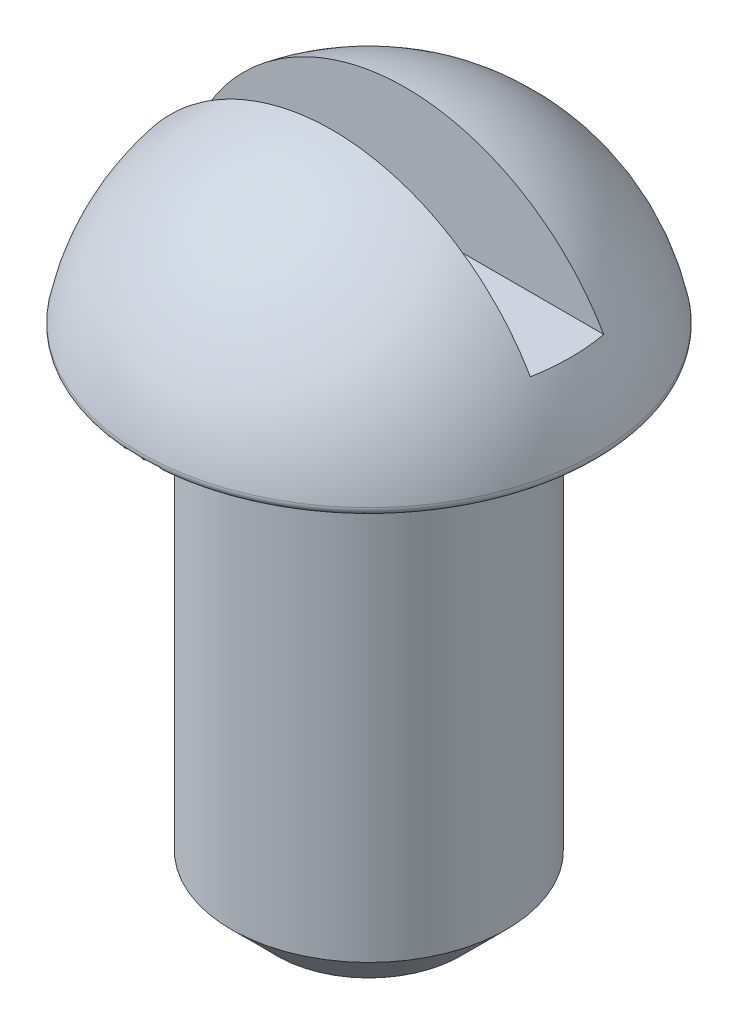
ISO-10303-21;
HEADER;
FILE_DESCRIPTION(('STEP AP214'),'2;1');
FILE_NAME('part.step','',(''),(''),'','','');
FILE_SCHEMA(('AUTOMOTIVE_DESIGN { 1 0 10303 214 1 1 1 1 }'));
ENDSEC;
DATA;
#1=APPLICATION_CONTEXT('core data for automotive mechanical design processes');
#2=APPLICATION_PROTOCOL_DEFINITION('international standard','automotive_design',2000,#1);
#3=PRODUCT_CONTEXT('',#1,'mechanical');
#4=PRODUCT('Part','Part','',(#3));
#5=PRODUCT_RELATED_PRODUCT_CATEGORY('part','',(#4));
#6=PRODUCT_DEFINITION_FORMATION('','',#4);
#7=PRODUCT_DEFINITION_CONTEXT('part definition',#1,'design');
#8=PRODUCT_DEFINITION('design','',#6,#7);
#9=PRODUCT_DEFINITION_SHAPE('','',#8);
#10=(LENGTH_UNIT() NAMED_UNIT(*) SI_UNIT(.MILLI.,.METRE.));
#11=(NAMED_UNIT(*) PLANE_ANGLE_UNIT() SI_UNIT($,.RADIAN.));
#12=(NAMED_UNIT(*) SI_UNIT($,.STERADIAN.) SOLID_ANGLE_UNIT());
#13=UNCERTAINTY_MEASURE_WITH_UNIT(LENGTH_MEASURE(1.E-05),#10,'distance_accuracy_value','');
#14=(GEOMETRIC_REPRESENTATION_CONTEXT(3) GLOBAL_UNCERTAINTY_ASSIGNED_CONTEXT((#13)) GLOBAL_UNIT_ASSIGNED_CONTEXT((#10,
#11,#12)) REPRESENTATION_CONTEXT('',''));
#15=CARTESIAN_POINT('',(0.,0.,0.));
#16=DIRECTION('',(0.,0.,1.));
#17=DIRECTION('',(1.,0.,0.));
#18=AXIS2_PLACEMENT_3D('',#15,#16,#17);
#19=CARTESIAN_POINT('',(0.,89.2175900971477,0.));
#20=DIRECTION('',(0.,1.,0.));
#21=DIRECTION('',(-1.,0.,0.));
#22=AXIS2_PLACEMENT_3D('',#19,#20,#21);
#23=DEGENERATE_TOROIDAL_SURFACE('',#22,0.0317230428537969,5.1,.F.);
#24=CARTESIAN_POINT('',(0.,90.2290623231183,0.));
#25=DIRECTION('',(0.,-1.,0.));
#26=DIRECTION('',(1.,0.,0.));
#27=AXIS2_PLACEMENT_3D('',#24,#25,#26);
#28=CIRCLE('',#27,4.96696917972703);
#29=CARTESIAN_POINT('',(4.96696917972703,90.2290623231183,0.));
#30=VERTEX_POINT('',#29);
#31=EDGE_CURVE('E109',#30,#30,#28,.F.);
#32=ORIENTED_EDGE('',*,*,#31,.T.);
#33=EDGE_LOOP('',(#32));
#34=FACE_BOUND('',#33,.T.);
#35=CARTESIAN_POINT('',(0.,91.7493131400015,0.));
#36=DIRECTION('',(0.,1.,0.));
#37=DIRECTION('',(0.,0.,1.));
#38=AXIS2_PLACEMENT_3D('',#35,#36,#37);
#39=CIRCLE('',#38,4.39550842097132);
#40=CARTESIAN_POINT('',(4.32209373785781,91.7493131400015,0.8));
#41=VERTEX_POINT('',#40);
#42=CARTESIAN_POINT('',(4.32209373785781,91.7493131400015,-0.8));
#43=VERTEX_POINT('',#42);
#44=EDGE_CURVE('E59',#41,#43,#39,.T.);
#45=ORIENTED_EDGE('',*,*,#44,.F.);
#46=CARTESIAN_POINT('',(0.,94.2493131400015,0.8));
#47=CARTESIAN_POINT('',(-0.134740307442988,94.2493085427857,0.8));
#48=CARTESIAN_POINT('',(-0.269527835350804,94.243664796133,0.8));
#49=CARTESIAN_POINT('',(-0.538288632330176,94.2212696538608,0.8));
#50=CARTESIAN_POINT('',(-0.672260633696777,94.2045040055317,0.8));
#51=CARTESIAN_POINT('',(-1.07466472708265,94.1373807183404,0.8));
#52=CARTESIAN_POINT('',(-1.34049574401895,94.0702039488135,0.8));
#53=CARTESIAN_POINT('',(-1.85788182126191,93.8934890746751,0.8));
#54=CARTESIAN_POINT('',(-2.10941818866405,93.7838969023489,0.8));
#55=CARTESIAN_POINT('',(-2.5987224591261,93.5213717601867,0.8));
#56=CARTESIAN_POINT('',(-2.83584195785824,93.3672258168607,0.8));
#57=CARTESIAN_POINT('',(-3.28090852228794,93.021510567915,0.8));
#58=CARTESIAN_POINT('',(-3.48886181324254,92.8299492692049,0.800000000000001));
#59=CARTESIAN_POINT('',(-3.8706865741645,92.4138533833618,0.800000000000001));
#60=CARTESIAN_POINT('',(-4.04440346673736,92.1891769072349,0.800000000000001));
#61=CARTESIAN_POINT('',(-4.35167938801028,91.7138362807661,0.800000000000001));
#62=CARTESIAN_POINT('',(-4.48523600357525,91.4631705700098,0.800000000000001));
#63=CARTESIAN_POINT('',(-4.70844617354246,90.9429089519378,0.800000000000001));
#64=CARTESIAN_POINT('',(-4.79808041716767,90.6733047776465,0.800000000000001));
#65=CARTESIAN_POINT('',(-4.93080788087344,90.122723546352,0.800000000000001));
#66=CARTESIAN_POINT('',(-4.97390155242599,89.841746599699,0.800000000000001));
#67=CARTESIAN_POINT('',(-5.00274861637339,89.4181129554516,0.800000000000001));
#68=CARTESIAN_POINT('',(-5.00639030410464,89.2764562420645,0.800000000000001));
#69=CARTESIAN_POINT('',(-5.00173379189394,88.9933532159882,0.800000000000001));
#70=CARTESIAN_POINT('',(-4.99343999670825,88.8519068449544,0.800000000000001));
#71=CARTESIAN_POINT('',(-4.96496113933905,88.570173081277,0.800000000000001));
#72=CARTESIAN_POINT('',(-4.94477164891222,88.4298861399686,0.800000000000001));
#73=CARTESIAN_POINT('',(-4.89265447612704,88.151560895802,0.800000000000001));
#74=CARTESIAN_POINT('',(-4.86073112906789,88.0135217820865,0.800000000000001));
#75=CARTESIAN_POINT('',(-4.7853566396299,87.7405712325978,0.800000000000001));
#76=CARTESIAN_POINT('',(-4.74190108429813,87.6056610156739,0.800000000000001));
#77=CARTESIAN_POINT('',(-4.64379511126672,87.340030847084,0.800000000000001));
#78=CARTESIAN_POINT('',(-4.58914883169654,87.2093093671029,0.800000000000001));
#79=CARTESIAN_POINT('',(-4.46901756133623,86.952886797671,0.800000000000001));
#80=CARTESIAN_POINT('',(-4.40352860026028,86.827187568234,0.800000000000001));
#81=CARTESIAN_POINT('',(-4.26221776818858,86.5817999134213,0.800000000000001));
#82=CARTESIAN_POINT('',(-4.1863997212632,86.4621092858577,0.800000000000001));
#83=CARTESIAN_POINT('',(-4.02492426614422,86.2295019598518,0.800000000000001));
#84=CARTESIAN_POINT('',(-3.93926364510018,86.1165874917231,0.800000000000001));
#85=CARTESIAN_POINT('',(-3.75876528803492,85.8984190720078,0.800000000000001));
#86=CARTESIAN_POINT('',(-3.66393095336552,85.7931623063323,0.8));
#87=CARTESIAN_POINT('',(-3.46569646326092,85.5909759683807,0.8));
#88=CARTESIAN_POINT('',(-3.36229325062922,85.4940493934858,0.8));
#89=CARTESIAN_POINT('',(-3.14772497637245,85.3092907085601,0.8));
#90=CARTESIAN_POINT('',(-3.03656279903408,85.2214552488649,0.8));
#91=CARTESIAN_POINT('',(-2.80721945837872,85.0554554259879,0.8));
#92=CARTESIAN_POINT('',(-2.68903753973223,84.9772921063359,0.8));
#93=CARTESIAN_POINT('',(-2.44654973940192,84.831234180271,0.8));
#94=CARTESIAN_POINT('',(-2.32224614451551,84.7633357773233,0.8));
#95=CARTESIAN_POINT('',(-2.06831629181173,84.6382422846071,0.8));
#96=CARTESIAN_POINT('',(-1.93868837414178,84.5810505639968,0.8));
#97=CARTESIAN_POINT('',(-1.67506389601165,84.4778149603087,0.8));
#98=CARTESIAN_POINT('',(-1.5410672602134,84.4317712695929,0.8));
#99=CARTESIAN_POINT('',(-1.26977080002715,84.3512198249581,0.8));
#100=CARTESIAN_POINT('',(-1.13247381938942,84.3167024961024,0.8));
#101=CARTESIAN_POINT('',(-0.855443575238245,84.2594537965441,0.8));
#102=CARTESIAN_POINT('',(-0.715710337675658,84.2367223003787,0.8));
#103=CARTESIAN_POINT('',(-0.434849415376107,84.2033532765143,0.8));
#104=CARTESIAN_POINT('',(-0.293722231274832,84.1927115554526,0.8));
#105=CARTESIAN_POINT('',(-0.0110836469692735,84.1838211535471,0.8));
#106=CARTESIAN_POINT('',(0.130427732141535,84.1855718055492,0.8));
#107=CARTESIAN_POINT('',(0.409772158897323,84.2012314410897,0.8));
#108=CARTESIAN_POINT('',(0.547619662692202,84.2148822845066,0.8));
#109=CARTESIAN_POINT('',(0.821656949929552,84.2536620275972,0.8));
#110=CARTESIAN_POINT('',(0.957846652986969,84.2787914815989,0.8));
#111=CARTESIAN_POINT('',(1.36262509817613,84.3710492832896,0.8));
#112=CARTESIAN_POINT('',(1.62757168531692,84.4550558146594,0.8));
#113=CARTESIAN_POINT('',(2.142547111017,84.666559476271,0.8));
#114=CARTESIAN_POINT('',(2.39239336921354,84.7944973257188,0.8));
#115=CARTESIAN_POINT('',(2.86737610264902,85.0900583763382,0.8));
#116=CARTESIAN_POINT('',(3.09251640739483,85.2576754143477,0.8));
#117=CARTESIAN_POINT('',(3.51422714639577,85.6300319402105,0.8));
#118=CARTESIAN_POINT('',(3.71044715076847,85.8351683615819,0.8));
#119=CARTESIAN_POINT('',(4.06571578247768,86.2754675977019,0.8));
#120=CARTESIAN_POINT('',(4.22476075862274,86.5106333583149,0.8));
#121=CARTESIAN_POINT('',(4.50126117243079,87.0045069594602,0.8));
#122=CARTESIAN_POINT('',(4.61868360820359,87.2632332774375,0.799999999999999));
#123=CARTESIAN_POINT('',(4.80843008334655,87.7967183022827,0.799999999999999));
#124=CARTESIAN_POINT('',(4.88075523191155,88.0714766146523,0.799999999999999));
#125=CARTESIAN_POINT('',(4.97826895865465,88.6292825699496,0.799999999999999));
#126=CARTESIAN_POINT('',(5.00344952754638,88.9123316130767,0.799999999999999));
#127=CARTESIAN_POINT('',(5.00593522337818,89.4786408333967,0.799999999999999));
#128=CARTESIAN_POINT('',(4.98324016958901,89.7619010113826,0.799999999999999));
#129=CARTESIAN_POINT('',(4.89061731486903,90.3205965919497,0.799999999999999));
#130=CARTESIAN_POINT('',(4.82068859257744,90.5960318417852,0.799999999999999));
#131=CARTESIAN_POINT('',(4.63557894391363,91.1312597779937,0.799999999999999));
#132=CARTESIAN_POINT('',(4.52039683038463,91.3910520537899,0.8));
#133=CARTESIAN_POINT('',(4.24804392609076,91.8876189280836,0.8));
#134=CARTESIAN_POINT('',(4.0908715856573,92.1243926766319,0.8));
#135=CARTESIAN_POINT('',(3.73902502945746,92.5681519258149,0.8));
#136=CARTESIAN_POINT('',(3.54435656995658,92.7751419902206,0.8));
#137=CARTESIAN_POINT('',(3.1231160659952,93.1534161988023,0.8));
#138=CARTESIAN_POINT('',(2.89655705835061,93.3247148629576,0.8));
#139=CARTESIAN_POINT('',(2.4177017274986,93.6269428774709,0.8));
#140=CARTESIAN_POINT('',(2.16538737162668,93.7578436815839,0.8));
#141=CARTESIAN_POINT('',(1.6422786709378,93.9753775693474,0.8));
#142=CARTESIAN_POINT('',(1.37147618584527,94.0619910090337,0.8));
#143=CARTESIAN_POINT('',(0.819588743853391,94.1880219485546,0.8));
#144=CARTESIAN_POINT('',(0.538533295387108,94.2275653368913,0.8));
#145=CARTESIAN_POINT('',(0.171114889922167,94.2470447676542,0.8));
#146=CARTESIAN_POINT('',(0.0855669667262859,94.2493160594681,0.8));
#147=CARTESIAN_POINT('',(0.,94.2493131400015,0.8));
#148=B_SPLINE_CURVE_WITH_KNOTS('',3,(#46,#47,#48,#49,#50,#51,#52,#53,#54,#55,#56,#57,#58,#59,
#60,#61,#62,#63,#64,#65,#66,#67,#68,#69,#70,#71,#72,#73,#74,#75,#76,#77,#78,#79,#80,#81,#82,#83,
#84,#85,#86,#87,#88,#89,#90,#91,#92,#93,#94,#95,#96,#97,#98,#99,#100,#101,#102,#103,#104,#105,
#106,#107,#108,#109,#110,#111,#112,#113,#114,#115,#116,#117,#118,#119,#120,#121,#122,#123,#124,
#125,#126,#127,#128,#129,#130,#131,#132,#133,#134,#135,#136,#137,#138,#139,#140,#141,#142,#143,
#144,#145,#146,#147),.UNSPECIFIED.,.T.,.F.,(4,2,2,2,2,2,2,2,2,2,2,2,2,2,2,2,2,2,2,2,2,2,2,2,2,2,
2,2,2,2,2,2,2,2,2,2,2,2,2,2,2,2,2,2,2,2,2,2,2,2,4),(0.,0.404172939796291,0.808864830104376,
1.62740624911861,2.44699453328071,3.29142444495087,4.13567384569077,4.98365184582015,
5.83168078874412,6.6800822397263,7.5284754606218,7.95317297049329,8.37771378713626,
8.80241274156028,9.226954940249,9.65165983050094,10.0762079551572,10.5009118826478,
10.9254589999038,11.3501450952619,11.7746743282772,12.1993556819883,12.623879998594,
13.0484500773804,13.4728627404297,13.8974087331678,14.3219620510308,14.7461618104412,
15.1703570540606,15.5944051197412,16.0184303565972,16.4334802390476,16.8485501673091,
17.6782492093378,18.5165274988801,19.3546756683486,20.202266073621,21.0499396910876,
21.8982839207727,22.7466072840996,23.5950747540977,24.4435454270442,25.292032651112,
26.1405421354919,26.9890829388305,27.8374935809967,28.6855583958258,29.5342211117814,
30.3832599320714,31.2300228654701,31.4866932942937),.UNSPECIFIED.);
#149=CARTESIAN_POINT('',(-4.32209373785782,91.7493131400015,0.800000000000001));
#150=VERTEX_POINT('',#149);
#151=EDGE_CURVE('E57',#41,#150,#148,.T.);
#152=ORIENTED_EDGE('',*,*,#151,.T.);
#153=CARTESIAN_POINT('',(-4.32209373785782,91.7493131400015,-0.799999999999999));
#154=VERTEX_POINT('',#153);
#155=EDGE_CURVE('E58',#154,#150,#39,.T.);
#156=ORIENTED_EDGE('',*,*,#155,.F.);
#157=CARTESIAN_POINT('',(0.,94.2493131400015,-0.8));
#158=CARTESIAN_POINT('',(0.134740307442975,94.2493085427857,-0.8));
#159=CARTESIAN_POINT('',(0.269527835350791,94.243664796133,-0.8));
#160=CARTESIAN_POINT('',(0.538288632330163,94.2212696538608,-0.8));
#161=CARTESIAN_POINT('',(0.672260633696764,94.2045040055317,-0.8));
#162=CARTESIAN_POINT('',(1.07466472708264,94.1373807183404,-0.8));
#163=CARTESIAN_POINT('',(1.34049574401893,94.0702039488135,-0.8));
#164=CARTESIAN_POINT('',(1.8578818212619,93.8934890746751,-0.8));
#165=CARTESIAN_POINT('',(2.10941818866404,93.7838969023489,-0.8));
#166=CARTESIAN_POINT('',(2.59872245912609,93.5213717601867,-0.8));
#167=CARTESIAN_POINT('',(2.83584195785822,93.3672258168607,-0.8));
#168=CARTESIAN_POINT('',(3.28090852228793,93.021510567915,-0.8));
#169=CARTESIAN_POINT('',(3.48886181324253,92.8299492692049,-0.8));
#170=CARTESIAN_POINT('',(3.87068657416448,92.4138533833618,-0.8));
#171=CARTESIAN_POINT('',(4.04440346673735,92.1891769072349,-0.8));
#172=CARTESIAN_POINT('',(4.35167938801026,91.7138362807661,-0.8));
#173=CARTESIAN_POINT('',(4.48523600357524,91.4631705700098,-0.800000000000001));
#174=CARTESIAN_POINT('',(4.70844617354244,90.9429089519378,-0.800000000000001));
#175=CARTESIAN_POINT('',(4.79808041716765,90.6733047776465,-0.800000000000001));
#176=CARTESIAN_POINT('',(4.93080788087342,90.122723546352,-0.800000000000001));
#177=CARTESIAN_POINT('',(4.97390155242597,89.841746599699,-0.800000000000001));
#178=CARTESIAN_POINT('',(5.00274861637338,89.4181129554516,-0.800000000000001));
#179=CARTESIAN_POINT('',(5.00639030410462,89.2764562420645,-0.800000000000001));
#180=CARTESIAN_POINT('',(5.00173379189393,88.9933532159882,-0.800000000000001));
#181=CARTESIAN_POINT('',(4.99343999670824,88.8519068449544,-0.800000000000001));
#182=CARTESIAN_POINT('',(4.96496113933904,88.570173081277,-0.800000000000001));
#183=CARTESIAN_POINT('',(4.94477164891221,88.4298861399686,-0.800000000000001));
#184=CARTESIAN_POINT('',(4.89265447612703,88.151560895802,-0.800000000000001));
#185=CARTESIAN_POINT('',(4.86073112906787,88.0135217820865,-0.800000000000001));
#186=CARTESIAN_POINT('',(4.78535663962989,87.7405712325978,-0.800000000000001));
#187=CARTESIAN_POINT('',(4.74190108429811,87.6056610156739,-0.800000000000001));
#188=CARTESIAN_POINT('',(4.64379511126671,87.340030847084,-0.800000000000001));
#189=CARTESIAN_POINT('',(4.58914883169653,87.2093093671029,-0.8));
#190=CARTESIAN_POINT('',(4.46901756133622,86.952886797671,-0.8));
#191=CARTESIAN_POINT('',(4.40352860026027,86.827187568234,-0.8));
#192=CARTESIAN_POINT('',(4.26221776818858,86.5817999134213,-0.8));
#193=CARTESIAN_POINT('',(4.18639972126319,86.4621092858577,-0.8));
#194=CARTESIAN_POINT('',(4.02492426614421,86.2295019598518,-0.8));
#195=CARTESIAN_POINT('',(3.93926364510018,86.1165874917231,-0.8));
#196=CARTESIAN_POINT('',(3.75876528803492,85.8984190720078,-0.8));
#197=CARTESIAN_POINT('',(3.66393095336552,85.7931623063323,-0.8));
#198=CARTESIAN_POINT('',(3.46569646326091,85.5909759683808,-0.8));
#199=CARTESIAN_POINT('',(3.36229325062922,85.4940493934858,-0.8));
#200=CARTESIAN_POINT('',(3.14772497637245,85.3092907085601,-0.8));
#201=CARTESIAN_POINT('',(3.03656279903407,85.2214552488649,-0.8));
#202=CARTESIAN_POINT('',(2.80721945837871,85.0554554259879,-0.8));
#203=CARTESIAN_POINT('',(2.68903753973222,84.9772921063359,-0.8));
#204=CARTESIAN_POINT('',(2.44654973940191,84.831234180271,-0.8));
#205=CARTESIAN_POINT('',(2.3222461445155,84.7633357773233,-0.8));
#206=CARTESIAN_POINT('',(2.06831629181173,84.6382422846071,-0.8));
#207=CARTESIAN_POINT('',(1.93868837414178,84.5810505639968,-0.8));
#208=CARTESIAN_POINT('',(1.67506389601164,84.4778149603087,-0.8));
#209=CARTESIAN_POINT('',(1.54106726021339,84.4317712695929,-0.8));
#210=CARTESIAN_POINT('',(1.26977080002714,84.3512198249581,-0.8));
#211=CARTESIAN_POINT('',(1.13247381938941,84.3167024961024,-0.8));
#212=CARTESIAN_POINT('',(0.855443575238235,84.2594537965441,-0.8));
#213=CARTESIAN_POINT('',(0.715710337675646,84.2367223003787,-0.8));
#214=CARTESIAN_POINT('',(0.434849415376093,84.2033532765143,-0.8));
#215=CARTESIAN_POINT('',(0.293722231274818,84.1927115554526,-0.8));
#216=CARTESIAN_POINT('',(0.0110836469692593,84.1838211535471,-0.8));
#217=CARTESIAN_POINT('',(-0.130427732141549,84.1855718055492,-0.8));
#218=CARTESIAN_POINT('',(-0.409772158897338,84.2012314410897,-0.8));
#219=CARTESIAN_POINT('',(-0.547619662692219,84.2148822845066,-0.8));
#220=CARTESIAN_POINT('',(-0.821656949929569,84.2536620275972,-0.8));
#221=CARTESIAN_POINT('',(-0.957846652986985,84.2787914815989,-0.8));
#222=CARTESIAN_POINT('',(-1.36262509817615,84.3710492832896,-0.8));
#223=CARTESIAN_POINT('',(-1.62757168531694,84.4550558146594,-0.8));
#224=CARTESIAN_POINT('',(-2.14254711101701,84.666559476271,-0.8));
#225=CARTESIAN_POINT('',(-2.39239336921355,84.7944973257188,-0.8));
#226=CARTESIAN_POINT('',(-2.86737610264903,85.0900583763382,-0.8));
#227=CARTESIAN_POINT('',(-3.09251640739484,85.2576754143477,-0.8));
#228=CARTESIAN_POINT('',(-3.51422714639579,85.6300319402105,-0.8));
#229=CARTESIAN_POINT('',(-3.71044715076849,85.8351683615819,-0.799999999999999));
#230=CARTESIAN_POINT('',(-4.06571578247769,86.2754675977019,-0.799999999999999));
#231=CARTESIAN_POINT('',(-4.22476075862275,86.5106333583149,-0.799999999999999));
#232=CARTESIAN_POINT('',(-4.50126117243081,87.0045069594602,-0.799999999999999));
#233=CARTESIAN_POINT('',(-4.6186836082036,87.2632332774375,-0.799999999999999));
#234=CARTESIAN_POINT('',(-4.80843008334656,87.7967183022827,-0.799999999999999));
#235=CARTESIAN_POINT('',(-4.88075523191156,88.0714766146523,-0.799999999999999));
#236=CARTESIAN_POINT('',(-4.97826895865466,88.6292825699496,-0.799999999999999));
#237=CARTESIAN_POINT('',(-5.00344952754639,88.9123316130767,-0.799999999999999));
#238=CARTESIAN_POINT('',(-5.00593522337819,89.4786408333967,-0.799999999999999));
#239=CARTESIAN_POINT('',(-4.98324016958903,89.7619010113826,-0.799999999999999));
#240=CARTESIAN_POINT('',(-4.89061731486904,90.3205965919498,-0.799999999999999));
#241=CARTESIAN_POINT('',(-4.82068859257745,90.5960318417852,-0.799999999999999));
#242=CARTESIAN_POINT('',(-4.63557894391363,91.1312597779937,-0.799999999999999));
#243=CARTESIAN_POINT('',(-4.52039683038464,91.3910520537899,-0.799999999999999));
#244=CARTESIAN_POINT('',(-4.24804392609078,91.8876189280836,-0.799999999999999));
#245=CARTESIAN_POINT('',(-4.09087158565732,92.1243926766319,-0.799999999999999));
#246=CARTESIAN_POINT('',(-3.73902502945747,92.568151925815,-0.799999999999999));
#247=CARTESIAN_POINT('',(-3.54435656995659,92.7751419902206,-0.8));
#248=CARTESIAN_POINT('',(-3.12311606599522,93.1534161988023,-0.8));
#249=CARTESIAN_POINT('',(-2.89655705835062,93.3247148629576,-0.8));
#250=CARTESIAN_POINT('',(-2.41770172749861,93.6269428774709,-0.8));
#251=CARTESIAN_POINT('',(-2.1653873716267,93.7578436815839,-0.8));
#252=CARTESIAN_POINT('',(-1.64227867093782,93.9753775693474,-0.8));
#253=CARTESIAN_POINT('',(-1.37147618584528,94.0619910090337,-0.8));
#254=CARTESIAN_POINT('',(-0.819588743853401,94.1880219485546,-0.8));
#255=CARTESIAN_POINT('',(-0.538533295387118,94.2275653368913,-0.8));
#256=CARTESIAN_POINT('',(-0.171114889922178,94.2470447676542,-0.8));
#257=CARTESIAN_POINT('',(-0.0855669667262978,94.2493160594681,-0.8));
#258=CARTESIAN_POINT('',(0.,94.2493131400015,-0.8));
#259=B_SPLINE_CURVE_WITH_KNOTS('',3,(#157,#158,#159,#160,#161,#162,#163,#164,#165,#166,#167,
#168,#169,#170,#171,#172,#173,#174,#175,#176,#177,#178,#179,#180,#181,#182,#183,#184,#185,#186,
#187,#188,#189,#190,#191,#192,#193,#194,#195,#196,#197,#198,#199,#200,#201,#202,#203,#204,#205,
#206,#207,#208,#209,#210,#211,#212,#213,#214,#215,#216,#217,#218,#219,#220,#221,#222,#223,#224,
#225,#226,#227,#228,#229,#230,#231,#232,#233,#234,#235,#236,#237,#238,#239,#240,#241,#242,#243,
#244,#245,#246,#247,#248,#249,#250,#251,#252,#253,#254,#255,#256,#257,#258),.UNSPECIFIED.,.T.,
.F.,(4,2,2,2,2,2,2,2,2,2,2,2,2,2,2,2,2,2,2,2,2,2,2,2,2,2,2,2,2,2,2,2,2,2,2,2,2,2,2,2,2,2,2,2,2,
2,2,2,2,2,4),(0.,0.404172939796291,0.808864830104376,1.62740624911861,2.44699453328071,
3.29142444495087,4.13567384569077,4.98365184582015,5.83168078874412,6.68008223972628,
7.5284754606218,7.95317297049329,8.37771378713625,8.80241274156027,9.226954940249,
9.65165983050094,10.0762079551572,10.5009118826478,10.9254589999038,11.3501450952619,
11.7746743282772,12.1993556819883,12.623879998594,13.0484500773804,13.4728627404297,
13.8974087331678,14.3219620510308,14.7461618104412,15.1703570540606,15.5944051197412,
16.0184303565972,16.4334802390476,16.8485501673091,17.6782492093378,18.5165274988801,
19.3546756683486,20.202266073621,21.0499396910876,21.8982839207727,22.7466072840996,
23.5950747540977,24.4435454270443,25.292032651112,26.1405421354919,26.9890829388305,
27.8374935809967,28.6855583958258,29.5342211117814,30.3832599320714,31.2300228654701,
31.4866932942937),.UNSPECIFIED.);
#260=EDGE_CURVE('E51',#154,#43,#259,.T.);
#261=ORIENTED_EDGE('',*,*,#260,.T.);
#262=EDGE_LOOP('',(#45,#152,#156,#261));
#263=FACE_BOUND('',#262,.T.);
#264=ADVANCED_FACE('F29',(#34,#263),#23,.F.);
#265=CARTESIAN_POINT('',(3.,90.0493131400015,0.));
#266=DIRECTION('',(0.,1.,0.));
#267=DIRECTION('',(-1.,0.,0.));
#268=AXIS2_PLACEMENT_3D('',#265,#266,#267);
#269=PLANE('',#268);
#270=CARTESIAN_POINT('',(0.,90.0493131400015,0.));
#271=DIRECTION('',(0.,1.,0.));
#272=DIRECTION('',(-1.,0.,0.));
#273=AXIS2_PLACEMENT_3D('',#270,#271,#272);
#274=CIRCLE('',#273,4.81994882023936);
#275=CARTESIAN_POINT('',(-4.81994882023937,90.0493131400015,0.));
#276=VERTEX_POINT('',#275);
#277=EDGE_CURVE('E104',#276,#276,#274,.F.);
#278=ORIENTED_EDGE('',*,*,#277,.T.);
#279=EDGE_LOOP('',(#278));
#280=FACE_BOUND('',#279,.T.);
#281=CARTESIAN_POINT('',(0.,90.0493131400015,0.));
#282=DIRECTION('',(0.,1.,0.));
#283=DIRECTION('',(-1.,0.,0.));
#284=AXIS2_PLACEMENT_3D('',#281,#282,#283);
#285=CIRCLE('',#284,3.00000000000001);
#286=CARTESIAN_POINT('',(-3.00000000000002,90.0493131400015,0.));
#287=VERTEX_POINT('',#286);
#288=EDGE_CURVE('E66',#287,#287,#285,.T.);
#289=ORIENTED_EDGE('',*,*,#288,.T.);
#290=EDGE_LOOP('',(#289));
#291=FACE_BOUND('',#290,.T.);
#292=ADVANCED_FACE('F92',(#280,#291),#269,.F.);
#293=CARTESIAN_POINT('',(0.,125.763182897862,0.));
#294=DIRECTION('',(0.,1.,0.));
#295=DIRECTION('',(-1.,0.,0.));
#296=AXIS2_PLACEMENT_3D('',#293,#294,#295);
#297=CYLINDRICAL_SURFACE('',#296,3.00000000000001);
#298=CARTESIAN_POINT('',(0.,80.2493131400015,0.));
#299=DIRECTION('',(0.,1.,0.));
#300=DIRECTION('',(-1.,0.,0.));
#301=AXIS2_PLACEMENT_3D('',#298,#299,#300);
#302=CIRCLE('',#301,3.00000000000001);
#303=CARTESIAN_POINT('',(-3.00000000000002,80.2493131400015,0.));
#304=VERTEX_POINT('',#303);
#305=EDGE_CURVE('E37',#304,#304,#302,.T.);
#306=ORIENTED_EDGE('',*,*,#305,.T.);
#307=EDGE_LOOP('',(#306));
#308=FACE_BOUND('',#307,.T.);
#309=ORIENTED_EDGE('',*,*,#288,.F.);
#310=EDGE_LOOP('',(#309));
#311=FACE_BOUND('',#310,.T.);
#312=ADVANCED_FACE('F89',(#308,#311),#297,.T.);
#313=CARTESIAN_POINT('',(3.00000000000001,79.2493131400015,0.));
#314=DIRECTION('',(0.,1.,0.));
#315=DIRECTION('',(-1.,0.,0.));
#316=AXIS2_PLACEMENT_3D('',#313,#314,#315);
#317=PLANE('',#316);
#318=CARTESIAN_POINT('',(0.,79.2493131400015,0.));
#319=DIRECTION('',(0.,1.,0.));
#320=DIRECTION('',(-1.,0.,0.));
#321=AXIS2_PLACEMENT_3D('',#318,#319,#320);
#322=CIRCLE('',#321,2.00000000000001);
#323=CARTESIAN_POINT('',(-2.00000000000002,79.2493131400015,0.));
#324=VERTEX_POINT('',#323);
#325=EDGE_CURVE('E11',#324,#324,#322,.F.);
#326=ORIENTED_EDGE('',*,*,#325,.T.);
#327=EDGE_LOOP('',(#326));
#328=FACE_BOUND('',#327,.T.);
#329=ADVANCED_FACE('F86',(#328),#317,.F.);
#330=CARTESIAN_POINT('',(-5.00000000000001,91.7493131400015,0.800000000000001));
#331=DIRECTION('',(0.,1.,0.));
#332=DIRECTION('',(0.,0.,1.));
#333=AXIS2_PLACEMENT_3D('',#330,#331,#332);
#334=PLANE('',#333);
#335=ORIENTED_EDGE('',*,*,#44,.T.);
#336=DIRECTION('',(-1.,0.,0.));
#337=VECTOR('',#336,1.);
#338=CARTESIAN_POINT('',(-5.00000000000001,91.7493131400015,-0.799999999999999));
#339=LINE('',#338,#337);
#340=EDGE_CURVE('E44',#43,#154,#339,.T.);
#341=ORIENTED_EDGE('',*,*,#340,.T.);
#342=ORIENTED_EDGE('',*,*,#155,.T.);
#343=DIRECTION('',(1.,0.,0.));
#344=VECTOR('',#343,1.);
#345=CARTESIAN_POINT('',(-5.00000000000001,91.7493131400015,0.800000000000001));
#346=LINE('',#345,#344);
#347=EDGE_CURVE('E65',#150,#41,#346,.T.);
#348=ORIENTED_EDGE('',*,*,#347,.T.);
#349=EDGE_LOOP('',(#335,#341,#342,#348));
#350=FACE_BOUND('',#349,.T.);
#351=ADVANCED_FACE('F64',(#350),#334,.T.);
#352=CARTESIAN_POINT('',(-5.00000000000001,91.7493131400015,-0.799999999999999));
#353=DIRECTION('',(0.,0.,-1.));
#354=DIRECTION('',(-1.,0.,0.));
#355=AXIS2_PLACEMENT_3D('',#352,#353,#354);
#356=PLANE('',#355);
#357=ORIENTED_EDGE('',*,*,#260,.F.);
#358=ORIENTED_EDGE('',*,*,#340,.F.);
#359=EDGE_LOOP('',(#357,#358));
#360=FACE_BOUND('',#359,.T.);
#361=ADVANCED_FACE('F83',(#360),#356,.F.);
#362=CARTESIAN_POINT('',(-5.00000000000001,91.7493131400015,0.800000000000001));
#363=DIRECTION('',(0.,0.,1.));
#364=DIRECTION('',(1.,0.,0.));
#365=AXIS2_PLACEMENT_3D('',#362,#363,#364);
#366=PLANE('',#365);
#367=ORIENTED_EDGE('',*,*,#151,.F.);
#368=ORIENTED_EDGE('',*,*,#347,.F.);
#369=EDGE_LOOP('',(#367,#368));
#370=FACE_BOUND('',#369,.T.);
#371=ADVANCED_FACE('F68',(#370),#366,.F.);
#372=CARTESIAN_POINT('',(0.,90.1993131400015,0.));
#373=DIRECTION('',(0.,1.,0.));
#374=DIRECTION('',(-1.,0.,0.));
#375=AXIS2_PLACEMENT_3D('',#372,#373,#374);
#376=TOROIDAL_SURFACE('',#375,4.81994882023936,0.15);
#377=ORIENTED_EDGE('',*,*,#277,.F.);
#378=EDGE_LOOP('',(#377));
#379=FACE_BOUND('',#378,.T.);
#380=ORIENTED_EDGE('',*,*,#31,.F.);
#381=EDGE_LOOP('',(#380));
#382=FACE_BOUND('',#381,.T.);
#383=ADVANCED_FACE('F82',(#379,#382),#376,.T.);
#384=CARTESIAN_POINT('',(0.,80.2493131400015,0.));
#385=DIRECTION('',(0.,1.,0.));
#386=DIRECTION('',(-1.,0.,0.));
#387=AXIS2_PLACEMENT_3D('',#384,#385,#386);
#388=CONICAL_SURFACE('',#387,3.00000000000001,0.785398163397446);
#389=ORIENTED_EDGE('',*,*,#325,.F.);
#390=EDGE_LOOP('',(#389));
#391=FACE_BOUND('',#390,.T.);
#392=ORIENTED_EDGE('',*,*,#305,.F.);
#393=EDGE_LOOP('',(#392));
#394=FACE_BOUND('',#393,.T.);
#395=ADVANCED_FACE('F115',(#391,#394),#388,.T.);
#396=CLOSED_SHELL('',(#264,#292,#312,#329,#351,#361,#371,#383,#395));
#397=MANIFOLD_SOLID_BREP('B2',#396);
#398=ADVANCED_BREP_SHAPE_REPRESENTATION('',(#18,#397),#14);
#399=SHAPE_DEFINITION_REPRESENTATION(#9,#398);
ENDSEC;
END-ISO-10303-21;
